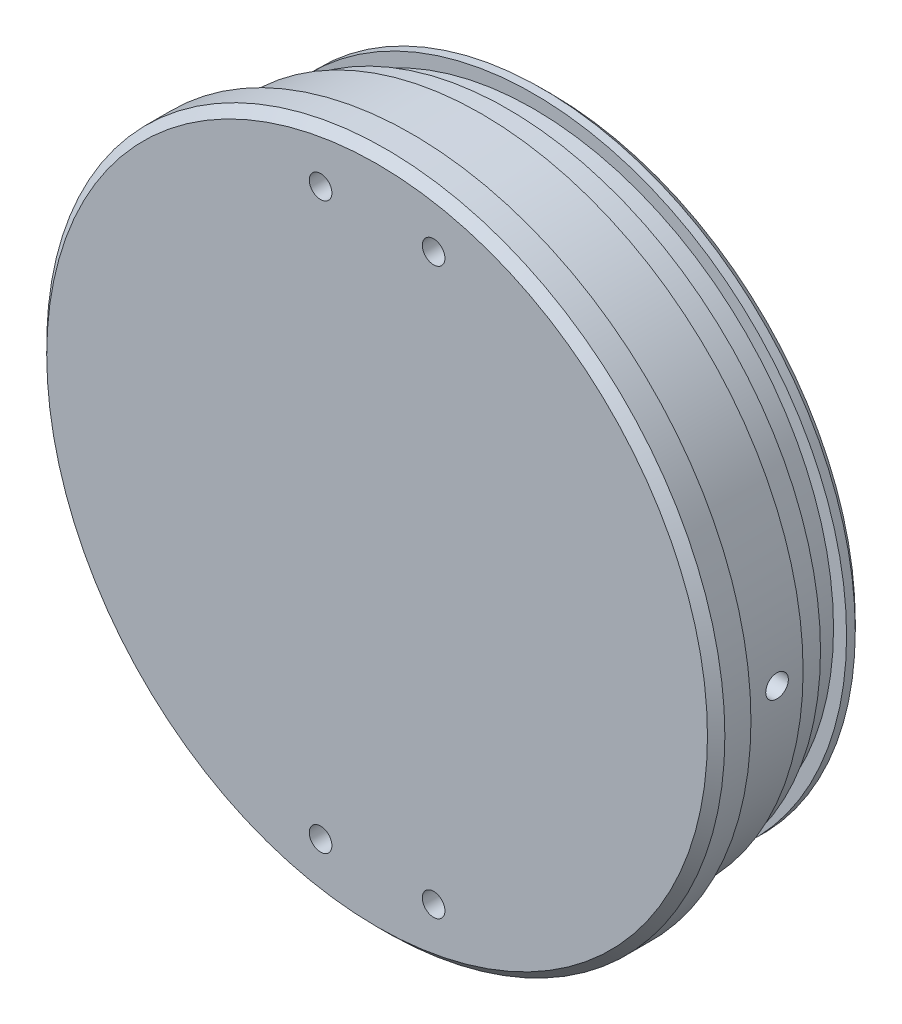
ISO-10303-21;
HEADER;
FILE_DESCRIPTION(('STEP AP214'),'2;1');
FILE_NAME('part.step','',(''),(''),'','','');
FILE_SCHEMA(('AUTOMOTIVE_DESIGN { 1 0 10303 214 1 1 1 1 }'));
ENDSEC;
DATA;
#1=APPLICATION_CONTEXT('core data for automotive mechanical design processes');
#2=APPLICATION_PROTOCOL_DEFINITION('international standard','automotive_design',2000,#1);
#3=PRODUCT_CONTEXT('',#1,'mechanical');
#4=PRODUCT('Part','Part','',(#3));
#5=PRODUCT_RELATED_PRODUCT_CATEGORY('part','',(#4));
#6=PRODUCT_DEFINITION_FORMATION('','',#4);
#7=PRODUCT_DEFINITION_CONTEXT('part definition',#1,'design');
#8=PRODUCT_DEFINITION('design','',#6,#7);
#9=PRODUCT_DEFINITION_SHAPE('','',#8);
#10=(LENGTH_UNIT() NAMED_UNIT(*) SI_UNIT(.MILLI.,.METRE.));
#11=(NAMED_UNIT(*) PLANE_ANGLE_UNIT() SI_UNIT($,.RADIAN.));
#12=(NAMED_UNIT(*) SI_UNIT($,.STERADIAN.) SOLID_ANGLE_UNIT());
#13=UNCERTAINTY_MEASURE_WITH_UNIT(LENGTH_MEASURE(1.E-05),#10,'distance_accuracy_value','');
#14=(GEOMETRIC_REPRESENTATION_CONTEXT(3) GLOBAL_UNCERTAINTY_ASSIGNED_CONTEXT((#13)) GLOBAL_UNIT_ASSIGNED_CONTEXT((#10,
#11,#12)) REPRESENTATION_CONTEXT('',''));
#15=CARTESIAN_POINT('',(0.,0.,0.));
#16=DIRECTION('',(0.,0.,1.));
#17=DIRECTION('',(1.,0.,0.));
#18=AXIS2_PLACEMENT_3D('',#15,#16,#17);
#19=CARTESIAN_POINT('',(0.,0.,-8.));
#20=DIRECTION('',(0.,0.,1.));
#21=DIRECTION('',(1.,0.,0.));
#22=AXIS2_PLACEMENT_3D('',#19,#20,#21);
#23=CYLINDRICAL_SURFACE('',#22,37.);
#24=CARTESIAN_POINT('',(37.,0.,-6.3));
#25=CARTESIAN_POINT('',(36.999999692756,-0.0729974026731535,-6.29999677030535));
#26=CARTESIAN_POINT('',(36.9997816581844,-0.14604716168001,-6.29383095099044));
#27=CARTESIAN_POINT('',(36.9989328356098,-0.290133193877359,-6.26932076489371));
#28=CARTESIAN_POINT('',(36.9983015559868,-0.361166963582807,-6.25096189217826));
#29=CARTESIAN_POINT('',(36.9966977255844,-0.49911282856842,-6.20259036584733));
#30=CARTESIAN_POINT('',(36.9957253432357,-0.56602693893172,-6.17258346305174));
#31=CARTESIAN_POINT('',(36.9935489546694,-0.693849589388301,-6.1017760365141));
#32=CARTESIAN_POINT('',(36.992345004623,-0.754759580486925,-6.06097812943751));
#33=CARTESIAN_POINT('',(36.989840247441,-0.868898430263472,-5.96971994391465));
#34=CARTESIAN_POINT('',(36.988539393154,-0.922123512130514,-5.91925494265173));
#35=CARTESIAN_POINT('',(36.9859878547732,-1.0193497564959,-5.81010376716681));
#36=CARTESIAN_POINT('',(36.9847371726899,-1.06335054969638,-5.75141726395071));
#37=CARTESIAN_POINT('',(36.9824267435996,-1.14088677501454,-5.62747280296282));
#38=CARTESIAN_POINT('',(36.981367042584,-1.17441968772315,-5.56221326818513));
#39=CARTESIAN_POINT('',(36.9795585601147,-1.2300519794446,-5.42698640922479));
#40=CARTESIAN_POINT('',(36.9788097771819,-1.25215141284756,-5.35701910743921));
#41=CARTESIAN_POINT('',(36.9777079380425,-1.28428061569889,-5.21439367286336));
#42=CARTESIAN_POINT('',(36.9773547172061,-1.29431540648077,-5.14173667252006));
#43=CARTESIAN_POINT('',(36.9770833356568,-1.30204595008821,-4.99576862234401));
#44=CARTESIAN_POINT('',(36.9771651728526,-1.2997417622214,-4.92245757565665));
#45=CARTESIAN_POINT('',(36.9777545255246,-1.28286397771534,-4.77729653667526));
#46=CARTESIAN_POINT('',(36.9782618527845,-1.26829580605639,-4.70544591275237));
#47=CARTESIAN_POINT('',(36.9796447005376,-1.22731198715899,-4.56521072336283));
#48=CARTESIAN_POINT('',(36.9805202219975,-1.20089630881104,-4.496826166998));
#49=CARTESIAN_POINT('',(36.9825409824663,-1.13696109969322,-4.3654468280593));
#50=CARTESIAN_POINT('',(36.9836862817994,-1.09943908498746,-4.30245325524787));
#51=CARTESIAN_POINT('',(36.9861174306428,-1.01435814937874,-4.18365729965185));
#52=CARTESIAN_POINT('',(36.9874032806147,-0.966799195520875,-4.12785494047959));
#53=CARTESIAN_POINT('',(36.9899714201115,-0.86296373505676,-4.02499384226211));
#54=CARTESIAN_POINT('',(36.9912537073339,-0.806682526211793,-3.97793984980934));
#55=CARTESIAN_POINT('',(36.9936695032932,-0.687016747489897,-3.89394772840861));
#56=CARTESIAN_POINT('',(36.9948030120037,-0.623632176357947,-3.85700960124793));
#57=CARTESIAN_POINT('',(36.9967935023537,-0.491556263494617,-3.79429826404827));
#58=CARTESIAN_POINT('',(36.9976504802106,-0.422864849188315,-3.76852520673158));
#59=CARTESIAN_POINT('',(36.9989912504288,-0.282126347945143,-3.72887865885826));
#60=CARTESIAN_POINT('',(36.9994750441774,-0.210079273484062,-3.7150051240649));
#61=CARTESIAN_POINT('',(37.0000147354506,-0.0647158459156081,-3.6995572642598));
#62=CARTESIAN_POINT('',(37.0000708614565,0.00859980846570713,-3.69797637189841));
#63=CARTESIAN_POINT('',(36.9997494963116,0.154455452305617,-3.70714155333695));
#64=CARTESIAN_POINT('',(36.9993720058577,0.226995443010638,-3.71788760732549));
#65=CARTESIAN_POINT('',(36.9982260931554,0.369222282132181,-3.75139620460861));
#66=CARTESIAN_POINT('',(36.9974577680333,0.438909834760445,-3.77415576248458));
#67=CARTESIAN_POINT('',(36.995616748615,0.573475257476682,-3.83104227805902));
#68=CARTESIAN_POINT('',(36.9945440534674,0.638353114110258,-3.8651692675547));
#69=CARTESIAN_POINT('',(36.9922145298634,0.761487711693835,-3.94383879650063));
#70=CARTESIAN_POINT('',(36.9909576234166,0.81974162959712,-3.98838575227888));
#71=CARTESIAN_POINT('',(36.9884015698475,0.927946373923233,-4.08662421077255));
#72=CARTESIAN_POINT('',(36.9871024225834,0.977897172458768,-4.14031574420019));
#73=CARTESIAN_POINT('',(36.9846076880682,1.06809972675826,-4.25534741791879));
#74=CARTESIAN_POINT('',(36.9834121462321,1.1083472427652,-4.31669088394973));
#75=CARTESIAN_POINT('',(36.9812601329251,1.17797177327199,-4.44526818098112));
#76=CARTESIAN_POINT('',(36.98030366081,1.20734881706195,-4.51250199610961));
#77=CARTESIAN_POINT('',(36.9787379549306,1.25439107157677,-4.65093556092295));
#78=CARTESIAN_POINT('',(36.9781286400916,1.27205901698602,-4.72213438035882));
#79=CARTESIAN_POINT('',(36.9773257219535,1.29519050572835,-4.86649001496465));
#80=CARTESIAN_POINT('',(36.9771321178728,1.30065407200455,-4.93964682645351));
#81=CARTESIAN_POINT('',(36.9771824791223,1.29922140363773,-5.08579944410709));
#82=CARTESIAN_POINT('',(36.9774262079489,1.29233184939442,-5.15879531593324));
#83=CARTESIAN_POINT('',(36.9783232624029,1.26640226841093,-5.30259358117951));
#84=CARTESIAN_POINT('',(36.9789765888368,1.24736221774592,-5.37339597028029));
#85=CARTESIAN_POINT('',(36.9806191493261,1.19767321091173,-5.5107995695251));
#86=CARTESIAN_POINT('',(36.9816083885455,1.16702407627468,-5.57740071506452));
#87=CARTESIAN_POINT('',(36.9838112211617,1.09498873742578,-5.70451115034016));
#88=CARTESIAN_POINT('',(36.9850248067027,1.05360290915866,-5.76502065327195));
#89=CARTESIAN_POINT('',(36.9875402281337,0.961247497714922,-5.87826198801786));
#90=CARTESIAN_POINT('',(36.9888421020838,0.910273764307471,-5.93099043401082));
#91=CARTESIAN_POINT('',(36.9913872734653,0.800182764822356,-6.02715625657639));
#92=CARTESIAN_POINT('',(36.9926305563329,0.741063488192185,-6.07059133250185));
#93=CARTESIAN_POINT('',(36.9949189265859,0.616331631519261,-6.14694750483036));
#94=CARTESIAN_POINT('',(36.9959638721507,0.550714455803476,-6.17986108928211));
#95=CARTESIAN_POINT('',(36.9977353635897,0.414932196638455,-6.23416595364798));
#96=CARTESIAN_POINT('',(36.9984622882013,0.344772637796414,-6.25557094636076));
#97=CARTESIAN_POINT('',(36.9993219667588,0.228476159429391,-6.28059058496487));
#98=CARTESIAN_POINT('',(36.9995751230325,0.183093779763454,-6.28785992932737));
#99=CARTESIAN_POINT('',(36.999914236252,0.0918145053710197,-6.2975656516485));
#100=CARTESIAN_POINT('',(37.0000001932659,0.045917610854265,-6.30000203157724));
#101=CARTESIAN_POINT('',(37.,0.,-6.3));
#102=B_SPLINE_CURVE_WITH_KNOTS('',3,(#24,#25,#26,#27,#28,#29,#30,#31,#32,#33,#34,#35,#36,#37,
#38,#39,#40,#41,#42,#43,#44,#45,#46,#47,#48,#49,#50,#51,#52,#53,#54,#55,#56,#57,#58,#59,#60,#61,
#62,#63,#64,#65,#66,#67,#68,#69,#70,#71,#72,#73,#74,#75,#76,#77,#78,#79,#80,#81,#82,#83,#84,#85,
#86,#87,#88,#89,#90,#91,#92,#93,#94,#95,#96,#97,#98,#99,#100,#101),.UNSPECIFIED.,.T.,.F.,(4,2,2,
2,2,2,2,2,2,2,2,2,2,2,2,2,2,2,2,2,2,2,2,2,2,2,2,2,2,2,2,2,2,2,2,2,2,2,4),(0.,0.218824600464826,
0.437910001460474,0.656887373760945,0.875811695757295,1.09484324631154,1.31388356420265,
1.53297656013568,1.75206851381342,1.97106924928726,2.19006893212901,2.4089717912074,
2.62787522509028,2.84682765383984,3.06578080150059,3.28485240186131,3.50392404092761,
3.72299867648774,3.94207249762956,4.16102927043867,4.3799856913496,4.5988877260427,
4.81779037305805,5.03678596694003,5.2557822963373,5.47487414137767,5.69396539607808,
5.91300546350874,6.13204511916358,6.35096635687322,6.56988802564917,6.78881306007157,
7.0077304298804,7.2267427794812,7.44580928474704,7.6650318477796,7.88399261903762,
8.02164007740514,8.15928747966236),.UNSPECIFIED.);
#103=CARTESIAN_POINT('',(37.,0.,-6.3));
#104=VERTEX_POINT('',#103);
#105=EDGE_CURVE('E74',#104,#104,#102,.T.);
#106=ORIENTED_EDGE('',*,*,#105,.T.);
#107=EDGE_LOOP('',(#106));
#108=FACE_BOUND('',#107,.T.);
#109=CARTESIAN_POINT('',(0.,0.,-8.));
#110=DIRECTION('',(0.,0.,-1.));
#111=DIRECTION('',(-1.,0.,0.));
#112=AXIS2_PLACEMENT_3D('',#109,#110,#111);
#113=CIRCLE('',#112,37.);
#114=CARTESIAN_POINT('',(-37.,0.,-8.));
#115=VERTEX_POINT('',#114);
#116=EDGE_CURVE('E153',#115,#115,#113,.T.);
#117=ORIENTED_EDGE('',*,*,#116,.F.);
#118=EDGE_LOOP('',(#117));
#119=FACE_BOUND('',#118,.T.);
#120=CARTESIAN_POINT('',(0.,0.,0.));
#121=DIRECTION('',(0.,0.,1.));
#122=DIRECTION('',(1.,0.,0.));
#123=AXIS2_PLACEMENT_3D('',#120,#121,#122);
#124=CIRCLE('',#123,37.);
#125=CARTESIAN_POINT('',(37.,0.,0.));
#126=VERTEX_POINT('',#125);
#127=EDGE_CURVE('E157',#126,#126,#124,.F.);
#128=ORIENTED_EDGE('',*,*,#127,.T.);
#129=EDGE_LOOP('',(#128));
#130=FACE_BOUND('',#129,.T.);
#131=CARTESIAN_POINT('',(-37.,0.,-3.7));
#132=CARTESIAN_POINT('',(-36.999999692756,0.0729974026731535,-3.70000322969465));
#133=CARTESIAN_POINT('',(-36.9997816581844,0.146047161680009,-3.70616904900956));
#134=CARTESIAN_POINT('',(-36.9989328356098,0.290133193877359,-3.73067923510629));
#135=CARTESIAN_POINT('',(-36.9983015559868,0.361166963582807,-3.74903810782175));
#136=CARTESIAN_POINT('',(-36.9966977255844,0.49911282856842,-3.79740963415267));
#137=CARTESIAN_POINT('',(-36.9957253432357,0.56602693893172,-3.82741653694826));
#138=CARTESIAN_POINT('',(-36.9935489546694,0.693849589388301,-3.8982239634859));
#139=CARTESIAN_POINT('',(-36.992345004623,0.754759580486925,-3.93902187056249));
#140=CARTESIAN_POINT('',(-36.989840247441,0.868898430263472,-4.03028005608536));
#141=CARTESIAN_POINT('',(-36.988539393154,0.922123512130514,-4.08074505734827));
#142=CARTESIAN_POINT('',(-36.9859878547732,1.0193497564959,-4.18989623283319));
#143=CARTESIAN_POINT('',(-36.9847371726899,1.06335054969638,-4.24858273604929));
#144=CARTESIAN_POINT('',(-36.9824267435996,1.14088677501454,-4.37252719703718));
#145=CARTESIAN_POINT('',(-36.981367042584,1.17441968772315,-4.43778673181487));
#146=CARTESIAN_POINT('',(-36.9795585601147,1.2300519794446,-4.57301359077521));
#147=CARTESIAN_POINT('',(-36.9788097771819,1.25215141284756,-4.64298089256079));
#148=CARTESIAN_POINT('',(-36.9777079380425,1.28428061569889,-4.78560632713664));
#149=CARTESIAN_POINT('',(-36.9773547172061,1.29431540648077,-4.85826332747994));
#150=CARTESIAN_POINT('',(-36.9770833356568,1.30204595008821,-5.00423137765599));
#151=CARTESIAN_POINT('',(-36.9771651728526,1.2997417622214,-5.07754242434335));
#152=CARTESIAN_POINT('',(-36.9777545255246,1.28286397771534,-5.22270346332474));
#153=CARTESIAN_POINT('',(-36.9782618527845,1.26829580605639,-5.29455408724763));
#154=CARTESIAN_POINT('',(-36.9796447005376,1.22731198715899,-5.43478927663717));
#155=CARTESIAN_POINT('',(-36.9805202219975,1.20089630881104,-5.503173833002));
#156=CARTESIAN_POINT('',(-36.9825409824663,1.13696109969322,-5.6345531719407));
#157=CARTESIAN_POINT('',(-36.9836862817994,1.09943908498746,-5.69754674475213));
#158=CARTESIAN_POINT('',(-36.9861174306428,1.01435814937874,-5.81634270034815));
#159=CARTESIAN_POINT('',(-36.9874032806147,0.966799195520875,-5.87214505952041));
#160=CARTESIAN_POINT('',(-36.9899714201115,0.86296373505676,-5.97500615773789));
#161=CARTESIAN_POINT('',(-36.9912537073339,0.806682526211794,-6.02206015019066));
#162=CARTESIAN_POINT('',(-36.9936695032932,0.687016747489897,-6.10605227159139));
#163=CARTESIAN_POINT('',(-36.9948030120037,0.623632176357947,-6.14299039875207));
#164=CARTESIAN_POINT('',(-36.9967935023537,0.491556263494617,-6.20570173595173));
#165=CARTESIAN_POINT('',(-36.9976504802106,0.422864849188315,-6.23147479326842));
#166=CARTESIAN_POINT('',(-36.9989912504288,0.282126347945143,-6.27112134114174));
#167=CARTESIAN_POINT('',(-36.9994750441774,0.210079273484062,-6.2849948759351));
#168=CARTESIAN_POINT('',(-37.0000147354506,0.0647158459156081,-6.3004427357402));
#169=CARTESIAN_POINT('',(-37.0000708614565,-0.00859980846570717,-6.30202362810159));
#170=CARTESIAN_POINT('',(-36.9997494963116,-0.154455452305617,-6.29285844666305));
#171=CARTESIAN_POINT('',(-36.9993720058577,-0.226995443010638,-6.28211239267451));
#172=CARTESIAN_POINT('',(-36.9982260931554,-0.369222282132181,-6.24860379539139));
#173=CARTESIAN_POINT('',(-36.9974577680333,-0.438909834760444,-6.22584423751542));
#174=CARTESIAN_POINT('',(-36.995616748615,-0.573475257476682,-6.16895772194098));
#175=CARTESIAN_POINT('',(-36.9945440534674,-0.638353114110258,-6.1348307324453));
#176=CARTESIAN_POINT('',(-36.9922145298634,-0.761487711693835,-6.05616120349938));
#177=CARTESIAN_POINT('',(-36.9909576234166,-0.81974162959712,-6.01161424772112));
#178=CARTESIAN_POINT('',(-36.9884015698475,-0.927946373923233,-5.91337578922745));
#179=CARTESIAN_POINT('',(-36.9871024225834,-0.977897172458767,-5.85968425579981));
#180=CARTESIAN_POINT('',(-36.9846076880682,-1.06809972675826,-5.74465258208121));
#181=CARTESIAN_POINT('',(-36.9834121462321,-1.1083472427652,-5.68330911605027));
#182=CARTESIAN_POINT('',(-36.9812601329251,-1.17797177327199,-5.55473181901888));
#183=CARTESIAN_POINT('',(-36.98030366081,-1.20734881706195,-5.48749800389039));
#184=CARTESIAN_POINT('',(-36.9787379549306,-1.25439107157677,-5.34906443907705));
#185=CARTESIAN_POINT('',(-36.9781286400916,-1.27205901698602,-5.27786561964118));
#186=CARTESIAN_POINT('',(-36.9773257219535,-1.29519050572835,-5.13350998503535));
#187=CARTESIAN_POINT('',(-36.9771321178728,-1.30065407200455,-5.06035317354649));
#188=CARTESIAN_POINT('',(-36.9771824791223,-1.29922140363773,-4.91420055589291));
#189=CARTESIAN_POINT('',(-36.9774262079489,-1.29233184939442,-4.84120468406676));
#190=CARTESIAN_POINT('',(-36.9783232624029,-1.26640226841093,-4.69740641882049));
#191=CARTESIAN_POINT('',(-36.9789765888368,-1.24736221774592,-4.62660402971971));
#192=CARTESIAN_POINT('',(-36.9806191493261,-1.19767321091173,-4.4892004304749));
#193=CARTESIAN_POINT('',(-36.9816083885455,-1.16702407627468,-4.42259928493548));
#194=CARTESIAN_POINT('',(-36.9838112211617,-1.09498873742578,-4.29548884965984));
#195=CARTESIAN_POINT('',(-36.9850248067027,-1.05360290915866,-4.23497934672805));
#196=CARTESIAN_POINT('',(-36.9875402281337,-0.961247497714923,-4.12173801198214));
#197=CARTESIAN_POINT('',(-36.9888421020838,-0.910273764307472,-4.06900956598918));
#198=CARTESIAN_POINT('',(-36.9913872734653,-0.800182764822357,-3.97284374342361));
#199=CARTESIAN_POINT('',(-36.9926305563329,-0.741063488192185,-3.92940866749815));
#200=CARTESIAN_POINT('',(-36.9949189265859,-0.616331631519261,-3.85305249516964));
#201=CARTESIAN_POINT('',(-36.9959638721507,-0.550714455803476,-3.82013891071789));
#202=CARTESIAN_POINT('',(-36.9977353635897,-0.414932196638455,-3.76583404635202));
#203=CARTESIAN_POINT('',(-36.9984622882013,-0.344772637796414,-3.74442905363924));
#204=CARTESIAN_POINT('',(-36.9993219667588,-0.228476159429391,-3.71940941503513));
#205=CARTESIAN_POINT('',(-36.9995751230325,-0.183093779763454,-3.71214007067263));
#206=CARTESIAN_POINT('',(-36.999914236252,-0.0918145053710197,-3.70243434835149));
#207=CARTESIAN_POINT('',(-37.0000001932659,-0.045917610854265,-3.69999796842276));
#208=CARTESIAN_POINT('',(-37.,0.,-3.7));
#209=B_SPLINE_CURVE_WITH_KNOTS('',3,(#131,#132,#133,#134,#135,#136,#137,#138,#139,#140,#141,
#142,#143,#144,#145,#146,#147,#148,#149,#150,#151,#152,#153,#154,#155,#156,#157,#158,#159,#160,
#161,#162,#163,#164,#165,#166,#167,#168,#169,#170,#171,#172,#173,#174,#175,#176,#177,#178,#179,
#180,#181,#182,#183,#184,#185,#186,#187,#188,#189,#190,#191,#192,#193,#194,#195,#196,#197,#198,
#199,#200,#201,#202,#203,#204,#205,#206,#207,#208),.UNSPECIFIED.,.T.,.F.,(4,2,2,2,2,2,2,2,2,2,2,
2,2,2,2,2,2,2,2,2,2,2,2,2,2,2,2,2,2,2,2,2,2,2,2,2,2,2,4),(0.,0.218824600464826,
0.437910001460474,0.656887373760945,0.875811695757295,1.09484324631154,1.31388356420265,
1.53297656013568,1.75206851381342,1.97106924928726,2.19006893212901,2.4089717912074,
2.62787522509028,2.84682765383984,3.06578080150059,3.28485240186131,3.50392404092761,
3.72299867648774,3.94207249762956,4.16102927043866,4.3799856913496,4.5988877260427,
4.81779037305805,5.03678596694003,5.2557822963373,5.47487414137767,5.69396539607808,
5.91300546350874,6.13204511916358,6.35096635687322,6.56988802564917,6.78881306007157,
7.0077304298804,7.22674277948119,7.44580928474704,7.6650318477796,7.88399261903762,
8.02164007740514,8.15928747966236),.UNSPECIFIED.);
#210=CARTESIAN_POINT('',(-37.,0.,-3.7));
#211=VERTEX_POINT('',#210);
#212=EDGE_CURVE('E66',#211,#211,#209,.T.);
#213=ORIENTED_EDGE('',*,*,#212,.F.);
#214=EDGE_LOOP('',(#213));
#215=FACE_BOUND('',#214,.T.);
#216=ADVANCED_FACE('F39',(#108,#119,#130,#215),#23,.T.);
#217=CARTESIAN_POINT('',(0.,0.,-16.));
#218=DIRECTION('',(0.,0.,1.));
#219=DIRECTION('',(1.,0.,0.));
#220=AXIS2_PLACEMENT_3D('',#217,#218,#219);
#221=CYLINDRICAL_SURFACE('',#220,36.);
#222=CARTESIAN_POINT('',(0.,0.,-8.));
#223=DIRECTION('',(0.,0.,-1.));
#224=DIRECTION('',(-1.,0.,0.));
#225=AXIS2_PLACEMENT_3D('',#222,#223,#224);
#226=CIRCLE('',#225,36.);
#227=CARTESIAN_POINT('',(-36.,0.,-8.));
#228=VERTEX_POINT('',#227);
#229=EDGE_CURVE('E429',#228,#228,#226,.T.);
#230=ORIENTED_EDGE('',*,*,#229,.T.);
#231=EDGE_LOOP('',(#230));
#232=FACE_BOUND('',#231,.T.);
#233=CARTESIAN_POINT('',(0.,0.,-11.));
#234=DIRECTION('',(0.,0.,1.));
#235=DIRECTION('',(1.,0.,0.));
#236=AXIS2_PLACEMENT_3D('',#233,#234,#235);
#237=CIRCLE('',#236,36.);
#238=CARTESIAN_POINT('',(36.,0.,-11.));
#239=VERTEX_POINT('',#238);
#240=EDGE_CURVE('E420',#239,#239,#237,.T.);
#241=ORIENTED_EDGE('',*,*,#240,.T.);
#242=EDGE_LOOP('',(#241));
#243=FACE_BOUND('',#242,.T.);
#244=ADVANCED_FACE('F128',(#232,#243),#221,.T.);
#245=CARTESIAN_POINT('',(0.,0.,4.));
#246=DIRECTION('',(0.,0.,-1.));
#247=DIRECTION('',(-1.,0.,0.));
#248=AXIS2_PLACEMENT_3D('',#245,#246,#247);
#249=CYLINDRICAL_SURFACE('',#248,39.);
#250=CARTESIAN_POINT('',(0.,0.,3.));
#251=DIRECTION('',(0.,0.,1.));
#252=DIRECTION('',(1.,0.,0.));
#253=AXIS2_PLACEMENT_3D('',#250,#251,#252);
#254=CIRCLE('',#253,39.);
#255=CARTESIAN_POINT('',(39.,0.,3.));
#256=VERTEX_POINT('',#255);
#257=EDGE_CURVE('E10',#256,#256,#254,.F.);
#258=ORIENTED_EDGE('',*,*,#257,.T.);
#259=EDGE_LOOP('',(#258));
#260=FACE_BOUND('',#259,.T.);
#261=CARTESIAN_POINT('',(0.,0.,0.));
#262=DIRECTION('',(0.,0.,1.));
#263=DIRECTION('',(1.,0.,0.));
#264=AXIS2_PLACEMENT_3D('',#261,#262,#263);
#265=CIRCLE('',#264,39.);
#266=CARTESIAN_POINT('',(39.,0.,0.));
#267=VERTEX_POINT('',#266);
#268=EDGE_CURVE('E161',#267,#267,#265,.T.);
#269=ORIENTED_EDGE('',*,*,#268,.T.);
#270=EDGE_LOOP('',(#269));
#271=FACE_BOUND('',#270,.T.);
#272=ADVANCED_FACE('F145',(#260,#271),#249,.T.);
#273=CARTESIAN_POINT('',(0.,0.,4.));
#274=DIRECTION('',(0.,0.,1.));
#275=DIRECTION('',(1.,0.,0.));
#276=AXIS2_PLACEMENT_3D('',#273,#274,#275);
#277=PLANE('',#276);
#278=CARTESIAN_POINT('',(0.,0.,4.));
#279=DIRECTION('',(0.,0.,1.));
#280=DIRECTION('',(1.,0.,0.));
#281=AXIS2_PLACEMENT_3D('',#278,#279,#280);
#282=CIRCLE('',#281,38.);
#283=CARTESIAN_POINT('',(38.,0.,4.));
#284=VERTEX_POINT('',#283);
#285=EDGE_CURVE('E47',#284,#284,#282,.T.);
#286=ORIENTED_EDGE('',*,*,#285,.T.);
#287=EDGE_LOOP('',(#286));
#288=FACE_BOUND('',#287,.T.);
#289=CARTESIAN_POINT('',(-6.5,32.5,4.));
#290=DIRECTION('',(0.,0.,1.));
#291=DIRECTION('',(-1.,0.,0.));
#292=AXIS2_PLACEMENT_3D('',#289,#290,#291);
#293=CIRCLE('',#292,1.3);
#294=CARTESIAN_POINT('',(-7.8,32.5,4.));
#295=VERTEX_POINT('',#294);
#296=EDGE_CURVE('E454',#295,#295,#293,.T.);
#297=ORIENTED_EDGE('',*,*,#296,.F.);
#298=EDGE_LOOP('',(#297));
#299=FACE_BOUND('',#298,.T.);
#300=CARTESIAN_POINT('',(6.49999999999997,-32.5,4.));
#301=DIRECTION('',(0.,0.,1.));
#302=DIRECTION('',(-1.,0.,0.));
#303=AXIS2_PLACEMENT_3D('',#300,#301,#302);
#304=CIRCLE('',#303,1.3);
#305=CARTESIAN_POINT('',(5.19999999999997,-32.5,4.));
#306=VERTEX_POINT('',#305);
#307=EDGE_CURVE('E448',#306,#306,#304,.T.);
#308=ORIENTED_EDGE('',*,*,#307,.F.);
#309=EDGE_LOOP('',(#308));
#310=FACE_BOUND('',#309,.T.);
#311=CARTESIAN_POINT('',(-6.50000000000003,-32.5,4.));
#312=DIRECTION('',(0.,0.,1.));
#313=DIRECTION('',(1.,0.,0.));
#314=AXIS2_PLACEMENT_3D('',#311,#312,#313);
#315=CIRCLE('',#314,1.3);
#316=CARTESIAN_POINT('',(-5.20000000000003,-32.5,4.));
#317=VERTEX_POINT('',#316);
#318=EDGE_CURVE('E442',#317,#317,#315,.T.);
#319=ORIENTED_EDGE('',*,*,#318,.F.);
#320=EDGE_LOOP('',(#319));
#321=FACE_BOUND('',#320,.T.);
#322=CARTESIAN_POINT('',(6.5,32.5,4.));
#323=DIRECTION('',(0.,0.,1.));
#324=DIRECTION('',(1.,0.,0.));
#325=AXIS2_PLACEMENT_3D('',#322,#323,#324);
#326=CIRCLE('',#325,1.3);
#327=CARTESIAN_POINT('',(7.8,32.5,4.));
#328=VERTEX_POINT('',#327);
#329=EDGE_CURVE('E414',#328,#328,#326,.T.);
#330=ORIENTED_EDGE('',*,*,#329,.F.);
#331=EDGE_LOOP('',(#330));
#332=FACE_BOUND('',#331,.T.);
#333=ADVANCED_FACE('F135',(#288,#299,#310,#321,#332),#277,.T.);
#334=CARTESIAN_POINT('',(0.,0.,0.));
#335=DIRECTION('',(0.,0.,1.));
#336=DIRECTION('',(1.,0.,0.));
#337=AXIS2_PLACEMENT_3D('',#334,#335,#336);
#338=PLANE('',#337);
#339=ORIENTED_EDGE('',*,*,#127,.F.);
#340=EDGE_LOOP('',(#339));
#341=FACE_BOUND('',#340,.T.);
#342=ORIENTED_EDGE('',*,*,#268,.F.);
#343=EDGE_LOOP('',(#342));
#344=FACE_BOUND('',#343,.T.);
#345=ADVANCED_FACE('F130',(#341,#344),#338,.F.);
#346=CARTESIAN_POINT('',(0.,0.,-8.));
#347=DIRECTION('',(0.,0.,-1.));
#348=DIRECTION('',(-1.,0.,0.));
#349=AXIS2_PLACEMENT_3D('',#346,#347,#348);
#350=PLANE('',#349);
#351=ORIENTED_EDGE('',*,*,#229,.F.);
#352=EDGE_LOOP('',(#351));
#353=FACE_BOUND('',#352,.T.);
#354=ORIENTED_EDGE('',*,*,#116,.T.);
#355=EDGE_LOOP('',(#354));
#356=FACE_BOUND('',#355,.T.);
#357=ADVANCED_FACE('F121',(#353,#356),#350,.T.);
#358=CARTESIAN_POINT('',(0.,36.,-14.));
#359=DIRECTION('',(0.,0.,1.));
#360=DIRECTION('',(1.,0.,0.));
#361=AXIS2_PLACEMENT_3D('',#358,#359,#360);
#362=PLANE('',#361);
#363=CARTESIAN_POINT('',(0.,0.,-14.));
#364=DIRECTION('',(0.,0.,1.));
#365=DIRECTION('',(1.,0.,0.));
#366=AXIS2_PLACEMENT_3D('',#363,#364,#365);
#367=CIRCLE('',#366,36.);
#368=CARTESIAN_POINT('',(36.,0.,-14.));
#369=VERTEX_POINT('',#368);
#370=EDGE_CURVE('E411',#369,#369,#367,.T.);
#371=ORIENTED_EDGE('',*,*,#370,.T.);
#372=EDGE_LOOP('',(#371));
#373=FACE_BOUND('',#372,.T.);
#374=CARTESIAN_POINT('',(0.,0.,-14.));
#375=DIRECTION('',(0.,0.,1.));
#376=DIRECTION('',(1.,0.,0.));
#377=AXIS2_PLACEMENT_3D('',#374,#375,#376);
#378=CIRCLE('',#377,34.5);
#379=CARTESIAN_POINT('',(34.5,0.,-14.));
#380=VERTEX_POINT('',#379);
#381=EDGE_CURVE('E426',#380,#380,#378,.T.);
#382=ORIENTED_EDGE('',*,*,#381,.F.);
#383=EDGE_LOOP('',(#382));
#384=FACE_BOUND('',#383,.T.);
#385=ADVANCED_FACE('F117',(#373,#384),#362,.T.);
#386=CARTESIAN_POINT('',(0.,0.,46.6509778830213));
#387=DIRECTION('',(0.,0.,1.));
#388=DIRECTION('',(1.,0.,0.));
#389=AXIS2_PLACEMENT_3D('',#386,#387,#388);
#390=CYLINDRICAL_SURFACE('',#389,34.5);
#391=ORIENTED_EDGE('',*,*,#381,.T.);
#392=EDGE_LOOP('',(#391));
#393=FACE_BOUND('',#392,.T.);
#394=CARTESIAN_POINT('',(0.,0.,-11.));
#395=DIRECTION('',(0.,0.,1.));
#396=DIRECTION('',(1.,0.,0.));
#397=AXIS2_PLACEMENT_3D('',#394,#395,#396);
#398=CIRCLE('',#397,34.5);
#399=CARTESIAN_POINT('',(34.5,0.,-11.));
#400=VERTEX_POINT('',#399);
#401=EDGE_CURVE('E423',#400,#400,#398,.T.);
#402=ORIENTED_EDGE('',*,*,#401,.F.);
#403=EDGE_LOOP('',(#402));
#404=FACE_BOUND('',#403,.T.);
#405=ADVANCED_FACE('F113',(#393,#404),#390,.T.);
#406=CARTESIAN_POINT('',(0.,36.,-11.));
#407=DIRECTION('',(0.,0.,-1.));
#408=DIRECTION('',(-1.,0.,0.));
#409=AXIS2_PLACEMENT_3D('',#406,#407,#408);
#410=PLANE('',#409);
#411=ORIENTED_EDGE('',*,*,#401,.T.);
#412=EDGE_LOOP('',(#411));
#413=FACE_BOUND('',#412,.T.);
#414=ORIENTED_EDGE('',*,*,#240,.F.);
#415=EDGE_LOOP('',(#414));
#416=FACE_BOUND('',#415,.T.);
#417=ADVANCED_FACE('F109',(#413,#416),#410,.T.);
#418=CARTESIAN_POINT('',(0.,0.,-16.));
#419=DIRECTION('',(0.,0.,-1.));
#420=DIRECTION('',(-1.,0.,0.));
#421=AXIS2_PLACEMENT_3D('',#418,#419,#420);
#422=PLANE('',#421);
#423=CARTESIAN_POINT('',(0.,0.,-16.));
#424=DIRECTION('',(0.,0.,-1.));
#425=DIRECTION('',(-1.,0.,0.));
#426=AXIS2_PLACEMENT_3D('',#423,#424,#425);
#427=CIRCLE('',#426,28.);
#428=CARTESIAN_POINT('',(-28.,0.,-16.));
#429=VERTEX_POINT('',#428);
#430=EDGE_CURVE('E51',#429,#429,#427,.F.);
#431=ORIENTED_EDGE('',*,*,#430,.T.);
#432=EDGE_LOOP('',(#431));
#433=FACE_BOUND('',#432,.T.);
#434=CARTESIAN_POINT('',(0.,0.,-16.));
#435=DIRECTION('',(0.,0.,-1.));
#436=DIRECTION('',(-1.,0.,0.));
#437=AXIS2_PLACEMENT_3D('',#434,#435,#436);
#438=CIRCLE('',#437,35.);
#439=CARTESIAN_POINT('',(-35.,0.,-16.));
#440=VERTEX_POINT('',#439);
#441=EDGE_CURVE('E160',#440,#440,#438,.T.);
#442=ORIENTED_EDGE('',*,*,#441,.T.);
#443=EDGE_LOOP('',(#442));
#444=FACE_BOUND('',#443,.T.);
#445=ADVANCED_FACE('F112',(#433,#444),#422,.T.);
#446=CARTESIAN_POINT('',(0.,0.,-15.));
#447=DIRECTION('',(0.,0.,-1.));
#448=DIRECTION('',(-1.,0.,0.));
#449=AXIS2_PLACEMENT_3D('',#446,#447,#448);
#450=CIRCLE('',#449,36.);
#451=CARTESIAN_POINT('',(-36.,0.,-15.));
#452=VERTEX_POINT('',#451);
#453=EDGE_CURVE('E164',#452,#452,#450,.F.);
#454=ORIENTED_EDGE('',*,*,#453,.T.);
#455=EDGE_LOOP('',(#454));
#456=FACE_BOUND('',#455,.T.);
#457=ORIENTED_EDGE('',*,*,#370,.F.);
#458=EDGE_LOOP('',(#457));
#459=FACE_BOUND('',#458,.T.);
#460=ADVANCED_FACE('F107',(#456,#459),#221,.T.);
#461=CARTESIAN_POINT('',(0.,0.,1.));
#462=DIRECTION('',(0.,0.,-1.));
#463=DIRECTION('',(-1.,0.,0.));
#464=AXIS2_PLACEMENT_3D('',#461,#462,#463);
#465=CYLINDRICAL_SURFACE('',#464,27.);
#466=CARTESIAN_POINT('',(0.,0.,0.));
#467=DIRECTION('',(0.,0.,-1.));
#468=DIRECTION('',(-1.,0.,0.));
#469=AXIS2_PLACEMENT_3D('',#466,#467,#468);
#470=CIRCLE('',#469,27.);
#471=CARTESIAN_POINT('',(-27.,0.,0.));
#472=VERTEX_POINT('',#471);
#473=EDGE_CURVE('E55',#472,#472,#470,.F.);
#474=ORIENTED_EDGE('',*,*,#473,.T.);
#475=EDGE_LOOP('',(#474));
#476=FACE_BOUND('',#475,.T.);
#477=CARTESIAN_POINT('',(0.,0.,-15.));
#478=DIRECTION('',(0.,0.,-1.));
#479=DIRECTION('',(-1.,0.,0.));
#480=AXIS2_PLACEMENT_3D('',#477,#478,#479);
#481=CIRCLE('',#480,27.);
#482=CARTESIAN_POINT('',(-27.,0.,-15.));
#483=VERTEX_POINT('',#482);
#484=EDGE_CURVE('E60',#483,#483,#481,.T.);
#485=ORIENTED_EDGE('',*,*,#484,.T.);
#486=EDGE_LOOP('',(#485));
#487=FACE_BOUND('',#486,.T.);
#488=ADVANCED_FACE('F103',(#476,#487),#465,.F.);
#489=CARTESIAN_POINT('',(0.,0.,1.));
#490=DIRECTION('',(0.,0.,-1.));
#491=DIRECTION('',(-1.,0.,0.));
#492=AXIS2_PLACEMENT_3D('',#489,#490,#491);
#493=PLANE('',#492);
#494=CARTESIAN_POINT('',(0.,0.,1.));
#495=DIRECTION('',(0.,0.,-1.));
#496=DIRECTION('',(-1.,0.,0.));
#497=AXIS2_PLACEMENT_3D('',#494,#495,#496);
#498=CIRCLE('',#497,26.);
#499=CARTESIAN_POINT('',(-26.,0.,1.));
#500=VERTEX_POINT('',#499);
#501=EDGE_CURVE('E63',#500,#500,#498,.T.);
#502=ORIENTED_EDGE('',*,*,#501,.T.);
#503=EDGE_LOOP('',(#502));
#504=FACE_BOUND('',#503,.T.);
#505=ADVANCED_FACE('F100',(#504),#493,.T.);
#506=CARTESIAN_POINT('',(0.,0.,-16.));
#507=DIRECTION('',(0.,0.,1.));
#508=DIRECTION('',(1.,0.,0.));
#509=AXIS2_PLACEMENT_3D('',#506,#507,#508);
#510=CONICAL_SURFACE('',#509,35.,0.785398163397441);
#511=ORIENTED_EDGE('',*,*,#453,.F.);
#512=EDGE_LOOP('',(#511));
#513=FACE_BOUND('',#512,.T.);
#514=ORIENTED_EDGE('',*,*,#441,.F.);
#515=EDGE_LOOP('',(#514));
#516=FACE_BOUND('',#515,.T.);
#517=ADVANCED_FACE('F98',(#513,#516),#510,.T.);
#518=CARTESIAN_POINT('',(30.,0.,-5.));
#519=DIRECTION('',(1.,0.,0.));
#520=DIRECTION('',(0.,0.,-1.));
#521=AXIS2_PLACEMENT_3D('',#518,#519,#520);
#522=CYLINDRICAL_SURFACE('',#521,1.3);
#523=CARTESIAN_POINT('',(30.,0.,-5.));
#524=DIRECTION('',(1.,0.,0.));
#525=DIRECTION('',(0.,0.,-1.));
#526=AXIS2_PLACEMENT_3D('',#523,#524,#525);
#527=CIRCLE('',#526,1.3);
#528=CARTESIAN_POINT('',(30.,0.,-6.3));
#529=VERTEX_POINT('',#528);
#530=EDGE_CURVE('E407',#529,#529,#527,.T.);
#531=ORIENTED_EDGE('',*,*,#530,.F.);
#532=EDGE_LOOP('',(#531));
#533=FACE_BOUND('',#532,.T.);
#534=ORIENTED_EDGE('',*,*,#105,.F.);
#535=EDGE_LOOP('',(#534));
#536=FACE_BOUND('',#535,.T.);
#537=ADVANCED_FACE('F93',(#533,#536),#522,.F.);
#538=CARTESIAN_POINT('',(30.,0.,-5.));
#539=DIRECTION('',(1.,0.,0.));
#540=DIRECTION('',(0.,0.,-1.));
#541=AXIS2_PLACEMENT_3D('',#538,#539,#540);
#542=PLANE('',#541);
#543=ORIENTED_EDGE('',*,*,#530,.T.);
#544=EDGE_LOOP('',(#543));
#545=FACE_BOUND('',#544,.T.);
#546=ADVANCED_FACE('F89',(#545),#542,.T.);
#547=CARTESIAN_POINT('',(-30.,0.,-5.));
#548=DIRECTION('',(-1.,0.,0.));
#549=DIRECTION('',(0.,0.,1.));
#550=AXIS2_PLACEMENT_3D('',#547,#548,#549);
#551=CYLINDRICAL_SURFACE('',#550,1.3);
#552=CARTESIAN_POINT('',(-30.,0.,-5.));
#553=DIRECTION('',(1.,0.,0.));
#554=DIRECTION('',(0.,0.,-1.));
#555=AXIS2_PLACEMENT_3D('',#552,#553,#554);
#556=CIRCLE('',#555,1.3);
#557=CARTESIAN_POINT('',(-30.,0.,-6.3));
#558=VERTEX_POINT('',#557);
#559=EDGE_CURVE('E406',#558,#558,#556,.T.);
#560=ORIENTED_EDGE('',*,*,#559,.T.);
#561=EDGE_LOOP('',(#560));
#562=FACE_BOUND('',#561,.T.);
#563=ORIENTED_EDGE('',*,*,#212,.T.);
#564=EDGE_LOOP('',(#563));
#565=FACE_BOUND('',#564,.T.);
#566=ADVANCED_FACE('F83',(#562,#565),#551,.F.);
#567=CARTESIAN_POINT('',(-30.,0.,-5.));
#568=DIRECTION('',(1.,0.,0.));
#569=DIRECTION('',(0.,0.,-1.));
#570=AXIS2_PLACEMENT_3D('',#567,#568,#569);
#571=PLANE('',#570);
#572=ORIENTED_EDGE('',*,*,#559,.F.);
#573=EDGE_LOOP('',(#572));
#574=FACE_BOUND('',#573,.T.);
#575=ADVANCED_FACE('F88',(#574),#571,.F.);
#576=CARTESIAN_POINT('',(6.5,32.5,-3.));
#577=DIRECTION('',(0.,0.,1.));
#578=DIRECTION('',(1.,0.,0.));
#579=AXIS2_PLACEMENT_3D('',#576,#577,#578);
#580=CYLINDRICAL_SURFACE('',#579,1.3);
#581=CARTESIAN_POINT('',(6.5,32.5,-3.));
#582=DIRECTION('',(0.,0.,1.));
#583=DIRECTION('',(1.,0.,0.));
#584=AXIS2_PLACEMENT_3D('',#581,#582,#583);
#585=CIRCLE('',#584,1.3);
#586=CARTESIAN_POINT('',(7.8,32.5,-3.));
#587=VERTEX_POINT('',#586);
#588=EDGE_CURVE('E408',#587,#587,#585,.T.);
#589=ORIENTED_EDGE('',*,*,#588,.F.);
#590=EDGE_LOOP('',(#589));
#591=FACE_BOUND('',#590,.T.);
#592=ORIENTED_EDGE('',*,*,#329,.T.);
#593=EDGE_LOOP('',(#592));
#594=FACE_BOUND('',#593,.T.);
#595=ADVANCED_FACE('F322',(#591,#594),#580,.F.);
#596=CARTESIAN_POINT('',(6.5,32.5,-3.));
#597=DIRECTION('',(0.,0.,1.));
#598=DIRECTION('',(1.,0.,0.));
#599=AXIS2_PLACEMENT_3D('',#596,#597,#598);
#600=PLANE('',#599);
#601=ORIENTED_EDGE('',*,*,#588,.T.);
#602=EDGE_LOOP('',(#601));
#603=FACE_BOUND('',#602,.T.);
#604=ADVANCED_FACE('F312',(#603),#600,.T.);
#605=CARTESIAN_POINT('',(-6.50000000000003,-32.5,-3.));
#606=DIRECTION('',(0.,0.,1.));
#607=DIRECTION('',(1.,0.,0.));
#608=AXIS2_PLACEMENT_3D('',#605,#606,#607);
#609=CYLINDRICAL_SURFACE('',#608,1.3);
#610=CARTESIAN_POINT('',(-6.50000000000003,-32.5,-3.));
#611=DIRECTION('',(0.,0.,1.));
#612=DIRECTION('',(1.,0.,0.));
#613=AXIS2_PLACEMENT_3D('',#610,#611,#612);
#614=CIRCLE('',#613,1.3);
#615=CARTESIAN_POINT('',(-5.20000000000003,-32.5,-3.));
#616=VERTEX_POINT('',#615);
#617=EDGE_CURVE('E445',#616,#616,#614,.T.);
#618=ORIENTED_EDGE('',*,*,#617,.F.);
#619=EDGE_LOOP('',(#618));
#620=FACE_BOUND('',#619,.T.);
#621=ORIENTED_EDGE('',*,*,#318,.T.);
#622=EDGE_LOOP('',(#621));
#623=FACE_BOUND('',#622,.T.);
#624=ADVANCED_FACE('F302',(#620,#623),#609,.F.);
#625=CARTESIAN_POINT('',(-6.50000000000003,-32.5,-3.));
#626=DIRECTION('',(0.,0.,1.));
#627=DIRECTION('',(1.,0.,0.));
#628=AXIS2_PLACEMENT_3D('',#625,#626,#627);
#629=PLANE('',#628);
#630=ORIENTED_EDGE('',*,*,#617,.T.);
#631=EDGE_LOOP('',(#630));
#632=FACE_BOUND('',#631,.T.);
#633=ADVANCED_FACE('F292',(#632),#629,.T.);
#634=CARTESIAN_POINT('',(6.49999999999997,-32.5,-3.));
#635=DIRECTION('',(0.,0.,1.));
#636=DIRECTION('',(1.,0.,0.));
#637=AXIS2_PLACEMENT_3D('',#634,#635,#636);
#638=CYLINDRICAL_SURFACE('',#637,1.3);
#639=CARTESIAN_POINT('',(6.49999999999997,-32.5,-3.));
#640=DIRECTION('',(0.,0.,1.));
#641=DIRECTION('',(-1.,0.,0.));
#642=AXIS2_PLACEMENT_3D('',#639,#640,#641);
#643=CIRCLE('',#642,1.3);
#644=CARTESIAN_POINT('',(5.19999999999997,-32.5,-3.));
#645=VERTEX_POINT('',#644);
#646=EDGE_CURVE('E451',#645,#645,#643,.T.);
#647=ORIENTED_EDGE('',*,*,#646,.F.);
#648=EDGE_LOOP('',(#647));
#649=FACE_BOUND('',#648,.T.);
#650=ORIENTED_EDGE('',*,*,#307,.T.);
#651=EDGE_LOOP('',(#650));
#652=FACE_BOUND('',#651,.T.);
#653=ADVANCED_FACE('F282',(#649,#652),#638,.F.);
#654=CARTESIAN_POINT('',(6.49999999999997,-32.5,-3.));
#655=DIRECTION('',(0.,0.,-1.));
#656=DIRECTION('',(-1.,0.,0.));
#657=AXIS2_PLACEMENT_3D('',#654,#655,#656);
#658=PLANE('',#657);
#659=ORIENTED_EDGE('',*,*,#646,.T.);
#660=EDGE_LOOP('',(#659));
#661=FACE_BOUND('',#660,.T.);
#662=ADVANCED_FACE('F272',(#661),#658,.F.);
#663=CARTESIAN_POINT('',(-6.5,32.5,-3.));
#664=DIRECTION('',(0.,0.,1.));
#665=DIRECTION('',(1.,0.,0.));
#666=AXIS2_PLACEMENT_3D('',#663,#664,#665);
#667=CYLINDRICAL_SURFACE('',#666,1.3);
#668=CARTESIAN_POINT('',(-6.5,32.5,-3.));
#669=DIRECTION('',(0.,0.,1.));
#670=DIRECTION('',(-1.,0.,0.));
#671=AXIS2_PLACEMENT_3D('',#668,#669,#670);
#672=CIRCLE('',#671,1.3);
#673=CARTESIAN_POINT('',(-7.8,32.5,-3.));
#674=VERTEX_POINT('',#673);
#675=EDGE_CURVE('E440',#674,#674,#672,.T.);
#676=ORIENTED_EDGE('',*,*,#675,.F.);
#677=EDGE_LOOP('',(#676));
#678=FACE_BOUND('',#677,.T.);
#679=ORIENTED_EDGE('',*,*,#296,.T.);
#680=EDGE_LOOP('',(#679));
#681=FACE_BOUND('',#680,.T.);
#682=ADVANCED_FACE('F262',(#678,#681),#667,.F.);
#683=CARTESIAN_POINT('',(-6.5,32.5,-3.));
#684=DIRECTION('',(0.,0.,-1.));
#685=DIRECTION('',(-1.,0.,0.));
#686=AXIS2_PLACEMENT_3D('',#683,#684,#685);
#687=PLANE('',#686);
#688=ORIENTED_EDGE('',*,*,#675,.T.);
#689=EDGE_LOOP('',(#688));
#690=FACE_BOUND('',#689,.T.);
#691=ADVANCED_FACE('F189',(#690),#687,.F.);
#692=CARTESIAN_POINT('',(0.,0.,1.));
#693=DIRECTION('',(0.,0.,-1.));
#694=DIRECTION('',(-1.,0.,0.));
#695=AXIS2_PLACEMENT_3D('',#692,#693,#694);
#696=CONICAL_SURFACE('',#695,26.,0.785398163397457);
#697=ORIENTED_EDGE('',*,*,#473,.F.);
#698=EDGE_LOOP('',(#697));
#699=FACE_BOUND('',#698,.T.);
#700=ORIENTED_EDGE('',*,*,#501,.F.);
#701=EDGE_LOOP('',(#700));
#702=FACE_BOUND('',#701,.T.);
#703=ADVANCED_FACE('F183',(#699,#702),#696,.F.);
#704=CARTESIAN_POINT('',(0.,0.,-15.));
#705=DIRECTION('',(0.,0.,-1.));
#706=DIRECTION('',(-1.,0.,0.));
#707=AXIS2_PLACEMENT_3D('',#704,#705,#706);
#708=CONICAL_SURFACE('',#707,27.,0.78539816339745);
#709=ORIENTED_EDGE('',*,*,#430,.F.);
#710=EDGE_LOOP('',(#709));
#711=FACE_BOUND('',#710,.T.);
#712=ORIENTED_EDGE('',*,*,#484,.F.);
#713=EDGE_LOOP('',(#712));
#714=FACE_BOUND('',#713,.T.);
#715=ADVANCED_FACE('F188',(#711,#714),#708,.F.);
#716=CARTESIAN_POINT('',(0.,0.,4.));
#717=DIRECTION('',(0.,0.,-1.));
#718=DIRECTION('',(-1.,0.,0.));
#719=AXIS2_PLACEMENT_3D('',#716,#717,#718);
#720=CONICAL_SURFACE('',#719,38.,0.785398163397441);
#721=ORIENTED_EDGE('',*,*,#257,.F.);
#722=EDGE_LOOP('',(#721));
#723=FACE_BOUND('',#722,.T.);
#724=ORIENTED_EDGE('',*,*,#285,.F.);
#725=EDGE_LOOP('',(#724));
#726=FACE_BOUND('',#725,.T.);
#727=ADVANCED_FACE('F42',(#723,#726),#720,.T.);
#728=CLOSED_SHELL('',(#216,#244,#272,#333,#345,#357,#385,#405,#417,#445,#460,#488,#505,#517,
#537,#546,#566,#575,#595,#604,#624,#633,#653,#662,#682,#691,#703,#715,#727));
#729=MANIFOLD_SOLID_BREP('B2',#728);
#730=ADVANCED_BREP_SHAPE_REPRESENTATION('',(#18,#729),#14);
#731=SHAPE_DEFINITION_REPRESENTATION(#9,#730);
ENDSEC;
END-ISO-10303-21;
